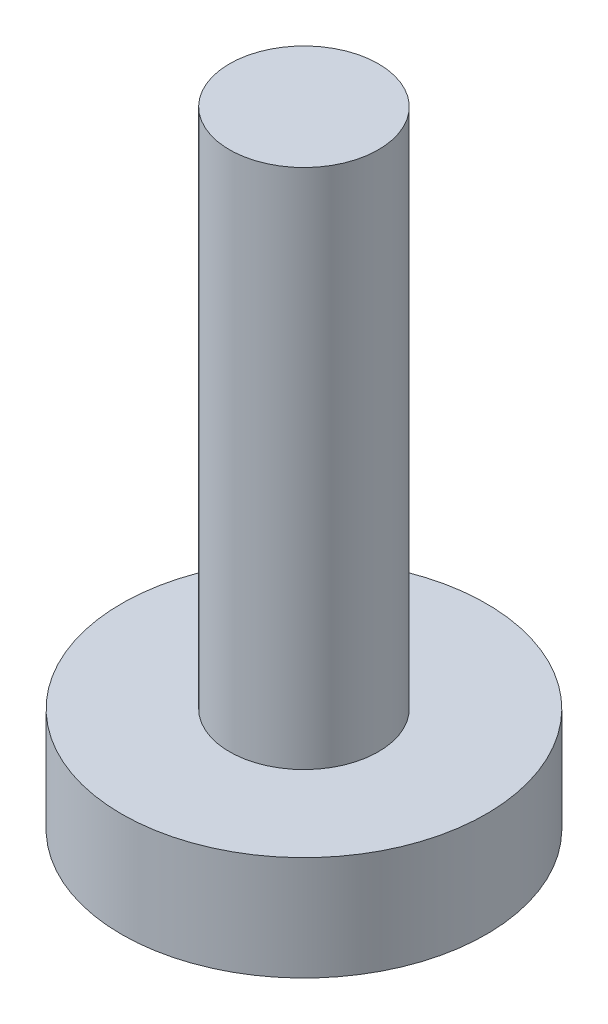
ISO-10303-21;
HEADER;
FILE_DESCRIPTION(('STEP AP214'),'2;1');
FILE_NAME('part.step','',(''),(''),'','','');
FILE_SCHEMA(('AUTOMOTIVE_DESIGN { 1 0 10303 214 1 1 1 1 }'));
ENDSEC;
DATA;
#1=APPLICATION_CONTEXT('core data for automotive mechanical design processes');
#2=APPLICATION_PROTOCOL_DEFINITION('international standard','automotive_design',2000,#1);
#3=PRODUCT_CONTEXT('',#1,'mechanical');
#4=PRODUCT('Part','Part','',(#3));
#5=PRODUCT_RELATED_PRODUCT_CATEGORY('part','',(#4));
#6=PRODUCT_DEFINITION_FORMATION('','',#4);
#7=PRODUCT_DEFINITION_CONTEXT('part definition',#1,'design');
#8=PRODUCT_DEFINITION('design','',#6,#7);
#9=PRODUCT_DEFINITION_SHAPE('','',#8);
#10=(LENGTH_UNIT() NAMED_UNIT(*) SI_UNIT(.MILLI.,.METRE.));
#11=(NAMED_UNIT(*) PLANE_ANGLE_UNIT() SI_UNIT($,.RADIAN.));
#12=(NAMED_UNIT(*) SI_UNIT($,.STERADIAN.) SOLID_ANGLE_UNIT());
#13=UNCERTAINTY_MEASURE_WITH_UNIT(LENGTH_MEASURE(1.E-05),#10,'distance_accuracy_value','');
#14=(GEOMETRIC_REPRESENTATION_CONTEXT(3) GLOBAL_UNCERTAINTY_ASSIGNED_CONTEXT((#13)) GLOBAL_UNIT_ASSIGNED_CONTEXT((#10,
#11,#12)) REPRESENTATION_CONTEXT('',''));
#15=CARTESIAN_POINT('',(0.,0.,0.));
#16=DIRECTION('',(0.,0.,1.));
#17=DIRECTION('',(1.,0.,0.));
#18=AXIS2_PLACEMENT_3D('',#15,#16,#17);
#19=CARTESIAN_POINT('',(0.,3.5,0.));
#20=DIRECTION('',(0.,1.,0.));
#21=DIRECTION('',(0.,0.,1.));
#22=AXIS2_PLACEMENT_3D('',#19,#20,#21);
#23=PLANE('',#22);
#24=CARTESIAN_POINT('',(0.,3.5,0.));
#25=DIRECTION('',(0.,1.,0.));
#26=DIRECTION('',(0.,0.,1.));
#27=AXIS2_PLACEMENT_3D('',#24,#25,#26);
#28=CIRCLE('',#27,6.12);
#29=CARTESIAN_POINT('',(0.,3.5,6.12));
#30=VERTEX_POINT('',#29);
#31=EDGE_CURVE('E10',#30,#30,#28,.T.);
#32=ORIENTED_EDGE('',*,*,#31,.T.);
#33=EDGE_LOOP('',(#32));
#34=FACE_BOUND('',#33,.T.);
#35=CARTESIAN_POINT('',(0.,3.5,0.));
#36=DIRECTION('',(0.,1.,0.));
#37=DIRECTION('',(0.,0.,1.));
#38=AXIS2_PLACEMENT_3D('',#35,#36,#37);
#39=CIRCLE('',#38,2.5);
#40=CARTESIAN_POINT('',(0.,3.5,-2.5));
#41=VERTEX_POINT('',#40);
#42=EDGE_CURVE('E42',#41,#41,#39,.T.);
#43=ORIENTED_EDGE('',*,*,#42,.F.);
#44=EDGE_LOOP('',(#43));
#45=FACE_BOUND('',#44,.T.);
#46=ADVANCED_FACE('F31',(#34,#45),#23,.T.);
#47=CARTESIAN_POINT('',(0.,0.,0.));
#48=DIRECTION('',(0.,1.,0.));
#49=DIRECTION('',(0.,0.,1.));
#50=AXIS2_PLACEMENT_3D('',#47,#48,#49);
#51=PLANE('',#50);
#52=CARTESIAN_POINT('',(0.,0.,0.));
#53=DIRECTION('',(0.,1.,0.));
#54=DIRECTION('',(0.,0.,1.));
#55=AXIS2_PLACEMENT_3D('',#52,#53,#54);
#56=CIRCLE('',#55,6.12);
#57=CARTESIAN_POINT('',(0.,0.,6.12));
#58=VERTEX_POINT('',#57);
#59=EDGE_CURVE('E35',#58,#58,#56,.T.);
#60=ORIENTED_EDGE('',*,*,#59,.F.);
#61=EDGE_LOOP('',(#60));
#62=FACE_BOUND('',#61,.T.);
#63=ADVANCED_FACE('F61',(#62),#51,.F.);
#64=CARTESIAN_POINT('',(0.,3.5,0.));
#65=DIRECTION('',(0.,-1.,0.));
#66=DIRECTION('',(0.,0.,-1.));
#67=AXIS2_PLACEMENT_3D('',#64,#65,#66);
#68=CYLINDRICAL_SURFACE('',#67,6.12);
#69=ORIENTED_EDGE('',*,*,#31,.F.);
#70=EDGE_LOOP('',(#69));
#71=FACE_BOUND('',#70,.T.);
#72=ORIENTED_EDGE('',*,*,#59,.T.);
#73=EDGE_LOOP('',(#72));
#74=FACE_BOUND('',#73,.T.);
#75=ADVANCED_FACE('F33',(#71,#74),#68,.T.);
#76=CARTESIAN_POINT('',(0.,21.,0.));
#77=DIRECTION('',(0.,-1.,0.));
#78=DIRECTION('',(0.,0.,-1.));
#79=AXIS2_PLACEMENT_3D('',#76,#77,#78);
#80=CYLINDRICAL_SURFACE('',#79,2.5);
#81=CARTESIAN_POINT('',(0.,21.,0.));
#82=DIRECTION('',(0.,1.,0.));
#83=DIRECTION('',(0.,0.,1.));
#84=AXIS2_PLACEMENT_3D('',#81,#82,#83);
#85=CIRCLE('',#84,2.5);
#86=CARTESIAN_POINT('',(0.,21.,-2.5));
#87=VERTEX_POINT('',#86);
#88=EDGE_CURVE('E46',#87,#87,#85,.T.);
#89=CARTESIAN_POINT('',(0.,3.5,-2.5));
#90=CARTESIAN_POINT('',(0.,3.68229166666667,-2.5));
#91=CARTESIAN_POINT('',(0.,3.86458333333334,-2.5));
#92=CARTESIAN_POINT('',(0.,4.22916666666667,-2.5));
#93=CARTESIAN_POINT('',(0.,4.41145833333334,-2.5));
#94=CARTESIAN_POINT('',(0.,4.77604166666667,-2.5));
#95=CARTESIAN_POINT('',(0.,4.95833333333334,-2.5));
#96=CARTESIAN_POINT('',(0.,5.32291666666667,-2.5));
#97=CARTESIAN_POINT('',(0.,5.50520833333333,-2.5));
#98=CARTESIAN_POINT('',(0.,5.86979166666667,-2.5));
#99=CARTESIAN_POINT('',(0.,6.05208333333334,-2.5));
#100=CARTESIAN_POINT('',(0.,6.41666666666667,-2.5));
#101=CARTESIAN_POINT('',(0.,6.59895833333333,-2.5));
#102=CARTESIAN_POINT('',(0.,6.96354166666667,-2.5));
#103=CARTESIAN_POINT('',(0.,7.14583333333333,-2.5));
#104=CARTESIAN_POINT('',(0.,7.51041666666667,-2.5));
#105=CARTESIAN_POINT('',(0.,7.69270833333333,-2.5));
#106=CARTESIAN_POINT('',(0.,8.05729166666667,-2.5));
#107=CARTESIAN_POINT('',(0.,8.23958333333334,-2.5));
#108=CARTESIAN_POINT('',(0.,8.60416666666667,-2.5));
#109=CARTESIAN_POINT('',(0.,8.78645833333333,-2.5));
#110=CARTESIAN_POINT('',(0.,9.15104166666667,-2.5));
#111=CARTESIAN_POINT('',(0.,9.33333333333333,-2.5));
#112=CARTESIAN_POINT('',(0.,9.69791666666667,-2.5));
#113=CARTESIAN_POINT('',(0.,9.88020833333333,-2.5));
#114=CARTESIAN_POINT('',(0.,10.2447916666667,-2.5));
#115=CARTESIAN_POINT('',(0.,10.4270833333333,-2.5));
#116=CARTESIAN_POINT('',(0.,10.7916666666667,-2.5));
#117=CARTESIAN_POINT('',(0.,10.9739583333333,-2.5));
#118=CARTESIAN_POINT('',(0.,11.3385416666667,-2.5));
#119=CARTESIAN_POINT('',(0.,11.5208333333333,-2.5));
#120=CARTESIAN_POINT('',(0.,11.8854166666667,-2.5));
#121=CARTESIAN_POINT('',(0.,12.0677083333333,-2.5));
#122=CARTESIAN_POINT('',(0.,12.4322916666667,-2.5));
#123=CARTESIAN_POINT('',(0.,12.6145833333333,-2.5));
#124=CARTESIAN_POINT('',(0.,12.9791666666667,-2.5));
#125=CARTESIAN_POINT('',(0.,13.1614583333333,-2.5));
#126=CARTESIAN_POINT('',(0.,13.5260416666667,-2.5));
#127=CARTESIAN_POINT('',(0.,13.7083333333333,-2.5));
#128=CARTESIAN_POINT('',(0.,14.0729166666667,-2.5));
#129=CARTESIAN_POINT('',(0.,14.2552083333333,-2.5));
#130=CARTESIAN_POINT('',(0.,14.6197916666667,-2.5));
#131=CARTESIAN_POINT('',(0.,14.8020833333333,-2.5));
#132=CARTESIAN_POINT('',(0.,15.1666666666667,-2.5));
#133=CARTESIAN_POINT('',(0.,15.3489583333333,-2.5));
#134=CARTESIAN_POINT('',(0.,15.7135416666667,-2.5));
#135=CARTESIAN_POINT('',(0.,15.8958333333333,-2.5));
#136=CARTESIAN_POINT('',(0.,16.2604166666667,-2.5));
#137=CARTESIAN_POINT('',(0.,16.4427083333333,-2.5));
#138=CARTESIAN_POINT('',(0.,16.8072916666667,-2.5));
#139=CARTESIAN_POINT('',(0.,16.9895833333333,-2.5));
#140=CARTESIAN_POINT('',(0.,17.3541666666667,-2.5));
#141=CARTESIAN_POINT('',(0.,17.5364583333333,-2.5));
#142=CARTESIAN_POINT('',(0.,17.9010416666667,-2.5));
#143=CARTESIAN_POINT('',(0.,18.0833333333333,-2.5));
#144=CARTESIAN_POINT('',(0.,18.4479166666667,-2.5));
#145=CARTESIAN_POINT('',(0.,18.6302083333333,-2.5));
#146=CARTESIAN_POINT('',(0.,18.9947916666667,-2.5));
#147=CARTESIAN_POINT('',(0.,19.1770833333333,-2.5));
#148=CARTESIAN_POINT('',(0.,19.5416666666667,-2.5));
#149=CARTESIAN_POINT('',(0.,19.7239583333333,-2.5));
#150=CARTESIAN_POINT('',(0.,20.0885416666667,-2.5));
#151=CARTESIAN_POINT('',(0.,20.2708333333333,-2.5));
#152=CARTESIAN_POINT('',(0.,20.6354166666667,-2.5));
#153=CARTESIAN_POINT('',(0.,20.8177083333333,-2.5));
#154=CARTESIAN_POINT('',(0.,21.,-2.5));
#155=B_SPLINE_CURVE_WITH_KNOTS('',3,(#89,#90,#91,#92,#93,#94,#95,#96,#97,#98,#99,#100,#101,#102,
#103,#104,#105,#106,#107,#108,#109,#110,#111,#112,#113,#114,#115,#116,#117,#118,#119,#120,#121,
#122,#123,#124,#125,#126,#127,#128,#129,#130,#131,#132,#133,#134,#135,#136,#137,#138,#139,#140,
#141,#142,#143,#144,#145,#146,#147,#148,#149,#150,#151,#152,#153,#154),.UNSPECIFIED.,.F.,.F.,(4,
2,2,2,2,2,2,2,2,2,2,2,2,2,2,2,2,2,2,2,2,2,2,2,2,2,2,2,2,2,2,2,4),(0.,0.546874999999999,1.09375,
1.640625,2.1875,2.734375,3.28125,3.828125,4.375,4.921875,5.46875,6.015625,6.5625,7.109375,
7.65625,8.203125,8.75,9.296875,9.84374999999999,10.390625,10.9375,11.484375,12.03125,12.578125,
13.125,13.671875,14.21875,14.765625,15.3125,15.859375,16.40625,16.953125,17.5),.UNSPECIFIED.);
#156=EDGE_CURVE('BSEAM52',#41,#87,#155,.T.);
#157=ORIENTED_EDGE('',*,*,#42,.T.);
#158=ORIENTED_EDGE('',*,*,#88,.F.);
#159=ORIENTED_EDGE('',*,*,#156,.T.);
#160=ORIENTED_EDGE('',*,*,#156,.F.);
#161=EDGE_LOOP('',(#157,#159,#158,#160));
#162=FACE_BOUND('',#161,.T.);
#163=ADVANCED_FACE('F52',(#162),#80,.T.);
#164=CARTESIAN_POINT('',(0.,21.,0.));
#165=DIRECTION('',(0.,1.,0.));
#166=DIRECTION('',(0.,0.,1.));
#167=AXIS2_PLACEMENT_3D('',#164,#165,#166);
#168=PLANE('',#167);
#169=ORIENTED_EDGE('',*,*,#88,.T.);
#170=EDGE_LOOP('',(#169));
#171=FACE_BOUND('',#170,.T.);
#172=ADVANCED_FACE('F50',(#171),#168,.T.);
#173=CLOSED_SHELL('',(#46,#63,#75,#163,#172));
#174=MANIFOLD_SOLID_BREP('B2',#173);
#175=ADVANCED_BREP_SHAPE_REPRESENTATION('',(#18,#174),#14);
#176=SHAPE_DEFINITION_REPRESENTATION(#9,#175);
ENDSEC;
END-ISO-10303-21;
